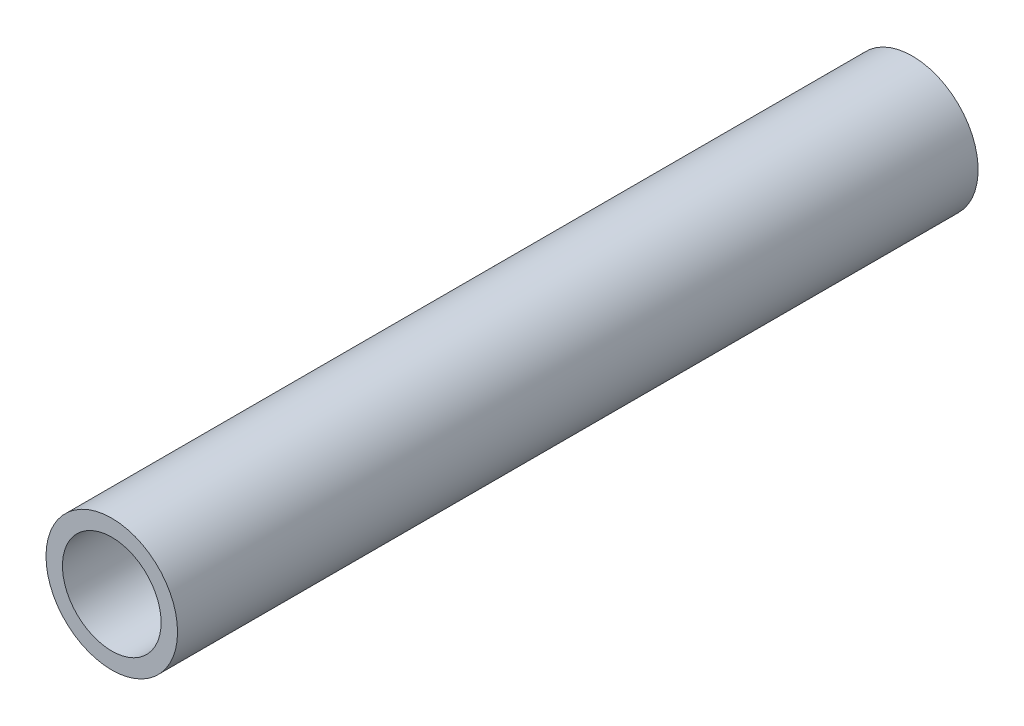
ISO-10303-21;
HEADER;
FILE_DESCRIPTION(('STEP AP214'),'2;1');
FILE_NAME('part.step','',(''),(''),'','','');
FILE_SCHEMA(('AUTOMOTIVE_DESIGN { 1 0 10303 214 1 1 1 1 }'));
ENDSEC;
DATA;
#1=APPLICATION_CONTEXT('core data for automotive mechanical design processes');
#2=APPLICATION_PROTOCOL_DEFINITION('international standard','automotive_design',2000,#1);
#3=PRODUCT_CONTEXT('',#1,'mechanical');
#4=PRODUCT('Part','Part','',(#3));
#5=PRODUCT_RELATED_PRODUCT_CATEGORY('part','',(#4));
#6=PRODUCT_DEFINITION_FORMATION('','',#4);
#7=PRODUCT_DEFINITION_CONTEXT('part definition',#1,'design');
#8=PRODUCT_DEFINITION('design','',#6,#7);
#9=PRODUCT_DEFINITION_SHAPE('','',#8);
#10=(LENGTH_UNIT() NAMED_UNIT(*) SI_UNIT(.MILLI.,.METRE.));
#11=(NAMED_UNIT(*) PLANE_ANGLE_UNIT() SI_UNIT($,.RADIAN.));
#12=(NAMED_UNIT(*) SI_UNIT($,.STERADIAN.) SOLID_ANGLE_UNIT());
#13=UNCERTAINTY_MEASURE_WITH_UNIT(LENGTH_MEASURE(1.E-05),#10,'distance_accuracy_value','');
#14=(GEOMETRIC_REPRESENTATION_CONTEXT(3) GLOBAL_UNCERTAINTY_ASSIGNED_CONTEXT((#13)) GLOBAL_UNIT_ASSIGNED_CONTEXT((#10,
#11,#12)) REPRESENTATION_CONTEXT('',''));
#15=CARTESIAN_POINT('',(0.,0.,0.));
#16=DIRECTION('',(0.,0.,1.));
#17=DIRECTION('',(1.,0.,0.));
#18=AXIS2_PLACEMENT_3D('',#15,#16,#17);
#19=CARTESIAN_POINT('',(3.51567080109097,3.55528603889425,-10.));
#20=DIRECTION('',(0.999990327947954,-0.00439818264098624,0.));
#21=DIRECTION('',(0.00439818264098624,0.999990327947954,0.));
#22=AXIS2_PLACEMENT_3D('',#19,#20,#21);
#23=PLANE('',#22);
#24=DIRECTION('',(0.00439818264098624,0.999990327947954,0.));
#25=VECTOR('',#24,1.);
#26=CARTESIAN_POINT('',(3.51567080109097,3.55528603889425,-25.));
#27=LINE('',#26,#25);
#28=CARTESIAN_POINT('',(3.48426149454471,-3.58607331738116,-25.));
#29=VERTEX_POINT('',#28);
#30=CARTESIAN_POINT('',(3.51567080109097,3.55528603889425,-25.));
#31=VERTEX_POINT('',#30);
#32=EDGE_CURVE('E11',#29,#31,#27,.T.);
#33=ORIENTED_EDGE('',*,*,#32,.F.);
#34=DIRECTION('',(0.,0.,-1.));
#35=VECTOR('',#34,1.);
#36=CARTESIAN_POINT('',(3.48426149454471,-3.58607331738116,-10.));
#37=LINE('',#36,#35);
#38=CARTESIAN_POINT('',(3.48426149454471,-3.58607331738116,-10.));
#39=VERTEX_POINT('',#38);
#40=EDGE_CURVE('E64',#39,#29,#37,.T.);
#41=ORIENTED_EDGE('',*,*,#40,.F.);
#42=DIRECTION('',(-0.00439818264098624,-0.999990327947954,0.));
#43=VECTOR('',#42,1.);
#44=CARTESIAN_POINT('',(3.51567080109097,3.55528603889425,-10.));
#45=LINE('',#44,#43);
#46=CARTESIAN_POINT('',(3.51567080109097,3.55528603889425,-10.));
#47=VERTEX_POINT('',#46);
#48=EDGE_CURVE('E81',#47,#39,#45,.T.);
#49=ORIENTED_EDGE('',*,*,#48,.F.);
#50=DIRECTION('',(0.,0.,-1.));
#51=VECTOR('',#50,1.);
#52=CARTESIAN_POINT('',(3.51567080109097,3.55528603889425,-10.));
#53=LINE('',#52,#51);
#54=EDGE_CURVE('E74',#47,#31,#53,.T.);
#55=ORIENTED_EDGE('',*,*,#54,.T.);
#56=EDGE_LOOP('',(#33,#41,#49,#55));
#57=FACE_BOUND('',#56,.T.);
#58=ADVANCED_FACE('F43',(#57),#23,.F.);
#59=CARTESIAN_POINT('',(0.,0.,208.44));
#60=DIRECTION('',(0.,0.,-1.));
#61=DIRECTION('',(-1.,0.,0.));
#62=AXIS2_PLACEMENT_3D('',#59,#60,#61);
#63=CYLINDRICAL_SURFACE('',#62,20.);
#64=CARTESIAN_POINT('',(0.,0.,208.44));
#65=DIRECTION('',(0.,0.,1.));
#66=DIRECTION('',(1.,0.,0.));
#67=AXIS2_PLACEMENT_3D('',#64,#65,#66);
#68=CIRCLE('',#67,20.);
#69=CARTESIAN_POINT('',(20.,0.,208.44));
#70=VERTEX_POINT('',#69);
#71=EDGE_CURVE('E52',#70,#70,#68,.T.);
#72=ORIENTED_EDGE('',*,*,#71,.F.);
#73=EDGE_LOOP('',(#72));
#74=FACE_BOUND('',#73,.T.);
#75=CARTESIAN_POINT('',(0.,0.,-35.));
#76=DIRECTION('',(0.,0.,-1.));
#77=DIRECTION('',(-1.,0.,0.));
#78=AXIS2_PLACEMENT_3D('',#75,#76,#77);
#79=CIRCLE('',#78,20.);
#80=CARTESIAN_POINT('',(-20.,0.,-35.));
#81=VERTEX_POINT('',#80);
#82=EDGE_CURVE('E86',#81,#81,#79,.T.);
#83=ORIENTED_EDGE('',*,*,#82,.F.);
#84=EDGE_LOOP('',(#83));
#85=FACE_BOUND('',#84,.T.);
#86=ADVANCED_FACE('F45',(#74,#85),#63,.T.);
#87=CARTESIAN_POINT('',(0.,0.,208.44));
#88=DIRECTION('',(0.,0.,1.));
#89=DIRECTION('',(1.,0.,0.));
#90=AXIS2_PLACEMENT_3D('',#87,#88,#89);
#91=PLANE('',#90);
#92=CARTESIAN_POINT('',(0.,0.,208.44));
#93=DIRECTION('',(0.,0.,1.));
#94=DIRECTION('',(1.,0.,0.));
#95=AXIS2_PLACEMENT_3D('',#92,#93,#94);
#96=CIRCLE('',#95,15.);
#97=CARTESIAN_POINT('',(15.,0.,208.44));
#98=VERTEX_POINT('',#97);
#99=EDGE_CURVE('E139',#98,#98,#96,.T.);
#100=ORIENTED_EDGE('',*,*,#99,.F.);
#101=EDGE_LOOP('',(#100));
#102=FACE_BOUND('',#101,.T.);
#103=ORIENTED_EDGE('',*,*,#71,.T.);
#104=EDGE_LOOP('',(#103));
#105=FACE_BOUND('',#104,.T.);
#106=ADVANCED_FACE('F98',(#102,#105),#91,.T.);
#107=CARTESIAN_POINT('',(0.,0.,-35.));
#108=DIRECTION('',(0.,0.,-1.));
#109=DIRECTION('',(-1.,0.,0.));
#110=AXIS2_PLACEMENT_3D('',#107,#108,#109);
#111=PLANE('',#110);
#112=CARTESIAN_POINT('',(0.,0.,-35.));
#113=DIRECTION('',(0.,0.,-1.));
#114=DIRECTION('',(-1.,0.,0.));
#115=AXIS2_PLACEMENT_3D('',#112,#113,#114);
#116=CIRCLE('',#115,5.);
#117=CARTESIAN_POINT('',(-5.,0.,-35.));
#118=VERTEX_POINT('',#117);
#119=EDGE_CURVE('E77',#118,#118,#116,.T.);
#120=ORIENTED_EDGE('',*,*,#119,.F.);
#121=EDGE_LOOP('',(#120));
#122=FACE_BOUND('',#121,.T.);
#123=ORIENTED_EDGE('',*,*,#82,.T.);
#124=EDGE_LOOP('',(#123));
#125=FACE_BOUND('',#124,.T.);
#126=ADVANCED_FACE('F104',(#122,#125),#111,.T.);
#127=CARTESIAN_POINT('',(0.,0.,-10.));
#128=DIRECTION('',(0.,0.,-1.));
#129=DIRECTION('',(-1.,0.,0.));
#130=AXIS2_PLACEMENT_3D('',#127,#128,#129);
#131=CYLINDRICAL_SURFACE('',#130,5.);
#132=ORIENTED_EDGE('',*,*,#119,.T.);
#133=EDGE_LOOP('',(#132));
#134=FACE_BOUND('',#133,.T.);
#135=CARTESIAN_POINT('',(0.,0.,-25.));
#136=DIRECTION('',(0.,0.,-1.));
#137=DIRECTION('',(-1.,0.,0.));
#138=AXIS2_PLACEMENT_3D('',#135,#136,#137);
#139=CIRCLE('',#138,5.);
#140=EDGE_CURVE('E57',#31,#29,#139,.T.);
#141=ORIENTED_EDGE('',*,*,#140,.F.);
#142=ORIENTED_EDGE('',*,*,#54,.F.);
#143=CARTESIAN_POINT('',(0.,0.,-10.));
#144=DIRECTION('',(0.,0.,-1.));
#145=DIRECTION('',(-1.,0.,0.));
#146=AXIS2_PLACEMENT_3D('',#143,#144,#145);
#147=CIRCLE('',#146,5.);
#148=EDGE_CURVE('E88',#39,#47,#147,.T.);
#149=ORIENTED_EDGE('',*,*,#148,.F.);
#150=ORIENTED_EDGE('',*,*,#40,.T.);
#151=EDGE_LOOP('',(#141,#142,#149,#150));
#152=FACE_BOUND('',#151,.T.);
#153=ADVANCED_FACE('F73',(#134,#152),#131,.F.);
#154=CARTESIAN_POINT('',(0.,0.,-10.));
#155=DIRECTION('',(0.,0.,-1.));
#156=DIRECTION('',(-1.,0.,0.));
#157=AXIS2_PLACEMENT_3D('',#154,#155,#156);
#158=PLANE('',#157);
#159=ORIENTED_EDGE('',*,*,#148,.T.);
#160=ORIENTED_EDGE('',*,*,#48,.T.);
#161=EDGE_LOOP('',(#159,#160));
#162=FACE_BOUND('',#161,.T.);
#163=ADVANCED_FACE('F112',(#162),#158,.T.);
#164=CARTESIAN_POINT('',(0.,0.,-25.));
#165=DIRECTION('',(0.,0.,-1.));
#166=DIRECTION('',(-1.,0.,0.));
#167=AXIS2_PLACEMENT_3D('',#164,#165,#166);
#168=PLANE('',#167);
#169=ORIENTED_EDGE('',*,*,#32,.T.);
#170=ORIENTED_EDGE('',*,*,#140,.T.);
#171=EDGE_LOOP('',(#169,#170));
#172=FACE_BOUND('',#171,.T.);
#173=ADVANCED_FACE('F70',(#172),#168,.T.);
#174=CARTESIAN_POINT('',(0.,0.,8.44));
#175=DIRECTION('',(0.,0.,1.));
#176=DIRECTION('',(1.,0.,0.));
#177=AXIS2_PLACEMENT_3D('',#174,#175,#176);
#178=CYLINDRICAL_SURFACE('',#177,15.);
#179=CARTESIAN_POINT('',(0.,0.,8.44));
#180=DIRECTION('',(0.,0.,1.));
#181=DIRECTION('',(1.,0.,0.));
#182=AXIS2_PLACEMENT_3D('',#179,#180,#181);
#183=CIRCLE('',#182,15.);
#184=CARTESIAN_POINT('',(15.,0.,8.44));
#185=VERTEX_POINT('',#184);
#186=EDGE_CURVE('E78',#185,#185,#183,.T.);
#187=ORIENTED_EDGE('',*,*,#186,.F.);
#188=EDGE_LOOP('',(#187));
#189=FACE_BOUND('',#188,.T.);
#190=ORIENTED_EDGE('',*,*,#99,.T.);
#191=EDGE_LOOP('',(#190));
#192=FACE_BOUND('',#191,.T.);
#193=ADVANCED_FACE('F127',(#189,#192),#178,.F.);
#194=CARTESIAN_POINT('',(0.,0.,8.44));
#195=DIRECTION('',(0.,0.,1.));
#196=DIRECTION('',(1.,0.,0.));
#197=AXIS2_PLACEMENT_3D('',#194,#195,#196);
#198=PLANE('',#197);
#199=ORIENTED_EDGE('',*,*,#186,.T.);
#200=EDGE_LOOP('',(#199));
#201=FACE_BOUND('',#200,.T.);
#202=ADVANCED_FACE('F130',(#201),#198,.T.);
#203=CLOSED_SHELL('',(#58,#86,#106,#126,#153,#163,#173,#193,#202));
#204=MANIFOLD_SOLID_BREP('B2',#203);
#205=ADVANCED_BREP_SHAPE_REPRESENTATION('',(#18,#204),#14);
#206=SHAPE_DEFINITION_REPRESENTATION(#9,#205);
ENDSEC;
END-ISO-10303-21;
